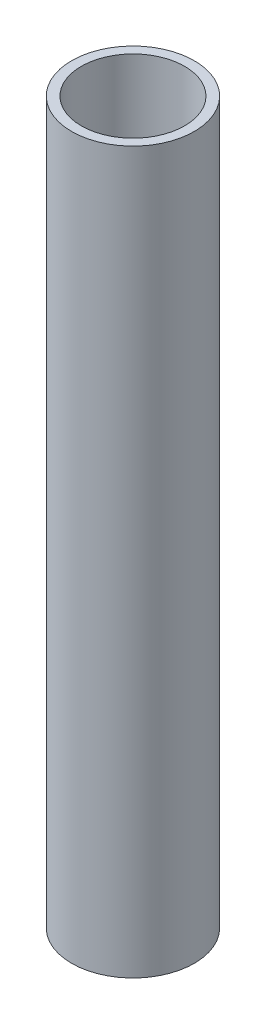
ISO-10303-21;
HEADER;
FILE_DESCRIPTION(('STEP AP214'),'2;1');
FILE_NAME('part.step','',(''),(''),'','','');
FILE_SCHEMA(('AUTOMOTIVE_DESIGN { 1 0 10303 214 1 1 1 1 }'));
ENDSEC;
DATA;
#1=APPLICATION_CONTEXT('core data for automotive mechanical design processes');
#2=APPLICATION_PROTOCOL_DEFINITION('international standard','automotive_design',2000,#1);
#3=PRODUCT_CONTEXT('',#1,'mechanical');
#4=PRODUCT('Part','Part','',(#3));
#5=PRODUCT_RELATED_PRODUCT_CATEGORY('part','',(#4));
#6=PRODUCT_DEFINITION_FORMATION('','',#4);
#7=PRODUCT_DEFINITION_CONTEXT('part definition',#1,'design');
#8=PRODUCT_DEFINITION('design','',#6,#7);
#9=PRODUCT_DEFINITION_SHAPE('','',#8);
#10=(LENGTH_UNIT() NAMED_UNIT(*) SI_UNIT(.MILLI.,.METRE.));
#11=(NAMED_UNIT(*) PLANE_ANGLE_UNIT() SI_UNIT($,.RADIAN.));
#12=(NAMED_UNIT(*) SI_UNIT($,.STERADIAN.) SOLID_ANGLE_UNIT());
#13=UNCERTAINTY_MEASURE_WITH_UNIT(LENGTH_MEASURE(1.E-05),#10,'distance_accuracy_value','');
#14=(GEOMETRIC_REPRESENTATION_CONTEXT(3) GLOBAL_UNCERTAINTY_ASSIGNED_CONTEXT((#13)) GLOBAL_UNIT_ASSIGNED_CONTEXT((#10,
#11,#12)) REPRESENTATION_CONTEXT('',''));
#15=CARTESIAN_POINT('',(0.,0.,0.));
#16=DIRECTION('',(0.,0.,1.));
#17=DIRECTION('',(1.,0.,0.));
#18=AXIS2_PLACEMENT_3D('',#15,#16,#17);
#19=CARTESIAN_POINT('',(0.,177.165,0.));
#20=DIRECTION('',(0.,1.,0.));
#21=DIRECTION('',(0.,0.,1.));
#22=AXIS2_PLACEMENT_3D('',#19,#20,#21);
#23=PLANE('',#22);
#24=CARTESIAN_POINT('',(0.,177.165,0.));
#25=DIRECTION('',(0.,1.,0.));
#26=DIRECTION('',(0.,0.,1.));
#27=AXIS2_PLACEMENT_3D('',#24,#25,#26);
#28=CIRCLE('',#27,30.1625);
#29=CARTESIAN_POINT('',(0.,177.165,30.1625));
#30=VERTEX_POINT('',#29);
#31=EDGE_CURVE('E10',#30,#30,#28,.T.);
#32=ORIENTED_EDGE('',*,*,#31,.T.);
#33=EDGE_LOOP('',(#32));
#34=FACE_BOUND('',#33,.T.);
#35=CARTESIAN_POINT('',(0.,177.165,0.));
#36=DIRECTION('',(0.,1.,0.));
#37=DIRECTION('',(0.,0.,1.));
#38=AXIS2_PLACEMENT_3D('',#35,#36,#37);
#39=CIRCLE('',#38,25.4);
#40=CARTESIAN_POINT('',(0.,177.165,25.4));
#41=VERTEX_POINT('',#40);
#42=EDGE_CURVE('E46',#41,#41,#39,.T.);
#43=ORIENTED_EDGE('',*,*,#42,.F.);
#44=EDGE_LOOP('',(#43));
#45=FACE_BOUND('',#44,.T.);
#46=ADVANCED_FACE('F35',(#34,#45),#23,.T.);
#47=CARTESIAN_POINT('',(0.,-177.165,0.));
#48=DIRECTION('',(0.,1.,0.));
#49=DIRECTION('',(0.,0.,1.));
#50=AXIS2_PLACEMENT_3D('',#47,#48,#49);
#51=PLANE('',#50);
#52=CARTESIAN_POINT('',(0.,-177.165,0.));
#53=DIRECTION('',(0.,1.,0.));
#54=DIRECTION('',(0.,0.,1.));
#55=AXIS2_PLACEMENT_3D('',#52,#53,#54);
#56=CIRCLE('',#55,30.1625);
#57=CARTESIAN_POINT('',(0.,-177.165,30.1625));
#58=VERTEX_POINT('',#57);
#59=EDGE_CURVE('E39',#58,#58,#56,.T.);
#60=ORIENTED_EDGE('',*,*,#59,.F.);
#61=EDGE_LOOP('',(#60));
#62=FACE_BOUND('',#61,.T.);
#63=CARTESIAN_POINT('',(0.,-177.165,0.));
#64=DIRECTION('',(0.,1.,0.));
#65=DIRECTION('',(0.,0.,1.));
#66=AXIS2_PLACEMENT_3D('',#63,#64,#65);
#67=CIRCLE('',#66,25.4);
#68=CARTESIAN_POINT('',(0.,-177.165,25.4));
#69=VERTEX_POINT('',#68);
#70=EDGE_CURVE('E48',#69,#69,#67,.T.);
#71=ORIENTED_EDGE('',*,*,#70,.T.);
#72=EDGE_LOOP('',(#71));
#73=FACE_BOUND('',#72,.T.);
#74=ADVANCED_FACE('F58',(#62,#73),#51,.F.);
#75=CARTESIAN_POINT('',(0.,177.165,0.));
#76=DIRECTION('',(0.,-1.,0.));
#77=DIRECTION('',(0.,0.,-1.));
#78=AXIS2_PLACEMENT_3D('',#75,#76,#77);
#79=CYLINDRICAL_SURFACE('',#78,30.1625);
#80=ORIENTED_EDGE('',*,*,#31,.F.);
#81=EDGE_LOOP('',(#80));
#82=FACE_BOUND('',#81,.T.);
#83=ORIENTED_EDGE('',*,*,#59,.T.);
#84=EDGE_LOOP('',(#83));
#85=FACE_BOUND('',#84,.T.);
#86=ADVANCED_FACE('F37',(#82,#85),#79,.T.);
#87=CARTESIAN_POINT('',(0.,177.165,0.));
#88=DIRECTION('',(0.,-1.,0.));
#89=DIRECTION('',(0.,0.,-1.));
#90=AXIS2_PLACEMENT_3D('',#87,#88,#89);
#91=CYLINDRICAL_SURFACE('',#90,25.4);
#92=ORIENTED_EDGE('',*,*,#42,.T.);
#93=EDGE_LOOP('',(#92));
#94=FACE_BOUND('',#93,.T.);
#95=ORIENTED_EDGE('',*,*,#70,.F.);
#96=EDGE_LOOP('',(#95));
#97=FACE_BOUND('',#96,.T.);
#98=ADVANCED_FACE('F54',(#94,#97),#91,.F.);
#99=CLOSED_SHELL('',(#46,#74,#86,#98));
#100=MANIFOLD_SOLID_BREP('B2',#99);
#101=ADVANCED_BREP_SHAPE_REPRESENTATION('',(#18,#100),#14);
#102=SHAPE_DEFINITION_REPRESENTATION(#9,#101);
ENDSEC;
END-ISO-10303-21;
